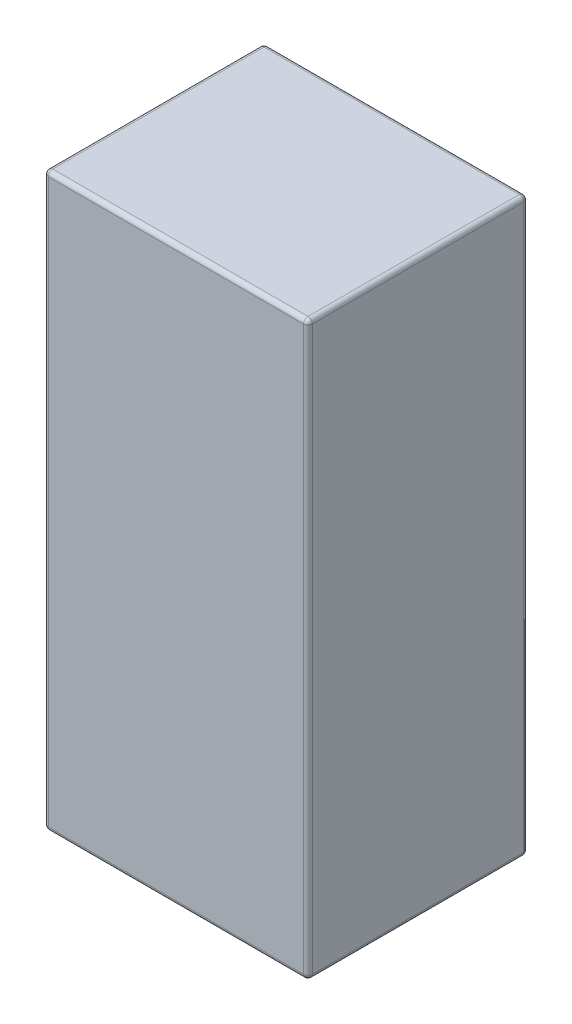
ISO-10303-21;
HEADER;
FILE_DESCRIPTION(('STEP AP214'),'2;1');
FILE_NAME('part.step','',(''),(''),'','','');
FILE_SCHEMA(('AUTOMOTIVE_DESIGN { 1 0 10303 214 1 1 1 1 }'));
ENDSEC;
DATA;
#1=APPLICATION_CONTEXT('core data for automotive mechanical design processes');
#2=APPLICATION_PROTOCOL_DEFINITION('international standard','automotive_design',2000,#1);
#3=PRODUCT_CONTEXT('',#1,'mechanical');
#4=PRODUCT('Part','Part','',(#3));
#5=PRODUCT_RELATED_PRODUCT_CATEGORY('part','',(#4));
#6=PRODUCT_DEFINITION_FORMATION('','',#4);
#7=PRODUCT_DEFINITION_CONTEXT('part definition',#1,'design');
#8=PRODUCT_DEFINITION('design','',#6,#7);
#9=PRODUCT_DEFINITION_SHAPE('','',#8);
#10=(LENGTH_UNIT() NAMED_UNIT(*) SI_UNIT(.MILLI.,.METRE.));
#11=(NAMED_UNIT(*) PLANE_ANGLE_UNIT() SI_UNIT($,.RADIAN.));
#12=(NAMED_UNIT(*) SI_UNIT($,.STERADIAN.) SOLID_ANGLE_UNIT());
#13=UNCERTAINTY_MEASURE_WITH_UNIT(LENGTH_MEASURE(1.E-05),#10,'distance_accuracy_value','');
#14=(GEOMETRIC_REPRESENTATION_CONTEXT(3) GLOBAL_UNCERTAINTY_ASSIGNED_CONTEXT((#13)) GLOBAL_UNIT_ASSIGNED_CONTEXT((#10,
#11,#12)) REPRESENTATION_CONTEXT('',''));
#15=CARTESIAN_POINT('',(0.,0.,0.));
#16=DIRECTION('',(0.,0.,1.));
#17=DIRECTION('',(1.,0.,0.));
#18=AXIS2_PLACEMENT_3D('',#15,#16,#17);
#19=CARTESIAN_POINT('',(3.,6.5,5.));
#20=DIRECTION('',(0.,-1.,0.));
#21=DIRECTION('',(0.,0.,-1.));
#22=AXIS2_PLACEMENT_3D('',#19,#20,#21);
#23=PLANE('',#22);
#24=DIRECTION('',(0.,0.,-1.));
#25=VECTOR('',#24,1.);
#26=CARTESIAN_POINT('',(-2.9,6.5,5.));
#27=LINE('',#26,#25);
#28=CARTESIAN_POINT('',(-2.9,6.5,0.1));
#29=VERTEX_POINT('',#28);
#30=CARTESIAN_POINT('',(-2.9,6.5,4.9));
#31=VERTEX_POINT('',#30);
#32=EDGE_CURVE('E138',#29,#31,#27,.F.);
#33=ORIENTED_EDGE('',*,*,#32,.T.);
#34=DIRECTION('',(-1.,0.,0.));
#35=VECTOR('',#34,1.);
#36=CARTESIAN_POINT('',(3.,6.5,4.9));
#37=LINE('',#36,#35);
#38=CARTESIAN_POINT('',(2.9,6.5,4.9));
#39=VERTEX_POINT('',#38);
#40=EDGE_CURVE('E175',#31,#39,#37,.F.);
#41=ORIENTED_EDGE('',*,*,#40,.T.);
#42=DIRECTION('',(0.,0.,-1.));
#43=VECTOR('',#42,1.);
#44=CARTESIAN_POINT('',(2.9,6.5,5.));
#45=LINE('',#44,#43);
#46=CARTESIAN_POINT('',(2.9,6.5,0.1));
#47=VERTEX_POINT('',#46);
#48=EDGE_CURVE('E172',#39,#47,#45,.T.);
#49=ORIENTED_EDGE('',*,*,#48,.T.);
#50=DIRECTION('',(-1.,0.,0.));
#51=VECTOR('',#50,1.);
#52=CARTESIAN_POINT('',(-3.,6.5,0.1));
#53=LINE('',#52,#51);
#54=EDGE_CURVE('E167',#47,#29,#53,.T.);
#55=ORIENTED_EDGE('',*,*,#54,.T.);
#56=EDGE_LOOP('',(#33,#41,#49,#55));
#57=FACE_BOUND('',#56,.T.);
#58=ADVANCED_FACE('F43',(#57),#23,.F.);
#59=CARTESIAN_POINT('',(-3.,-6.5,5.));
#60=DIRECTION('',(1.,0.,0.));
#61=DIRECTION('',(0.,0.,-1.));
#62=AXIS2_PLACEMENT_3D('',#59,#60,#61);
#63=PLANE('',#62);
#64=DIRECTION('',(0.,0.,-1.));
#65=VECTOR('',#64,1.);
#66=CARTESIAN_POINT('',(-3.,-6.4,5.));
#67=LINE('',#66,#65);
#68=CARTESIAN_POINT('',(-3.,-6.4,0.1));
#69=VERTEX_POINT('',#68);
#70=CARTESIAN_POINT('',(-3.,-6.4,4.9));
#71=VERTEX_POINT('',#70);
#72=EDGE_CURVE('E160',#69,#71,#67,.F.);
#73=ORIENTED_EDGE('',*,*,#72,.T.);
#74=DIRECTION('',(0.,-1.,0.));
#75=VECTOR('',#74,1.);
#76=CARTESIAN_POINT('',(-3.,-6.5,4.9));
#77=LINE('',#76,#75);
#78=CARTESIAN_POINT('',(-3.,6.4,4.9));
#79=VERTEX_POINT('',#78);
#80=EDGE_CURVE('E164',#71,#79,#77,.F.);
#81=ORIENTED_EDGE('',*,*,#80,.T.);
#82=DIRECTION('',(0.,0.,-1.));
#83=VECTOR('',#82,1.);
#84=CARTESIAN_POINT('',(-3.,6.4,5.));
#85=LINE('',#84,#83);
#86=CARTESIAN_POINT('',(-3.,6.4,0.1));
#87=VERTEX_POINT('',#86);
#88=EDGE_CURVE('E136',#79,#87,#85,.T.);
#89=ORIENTED_EDGE('',*,*,#88,.T.);
#90=DIRECTION('',(0.,-1.,0.));
#91=VECTOR('',#90,1.);
#92=CARTESIAN_POINT('',(-3.,-6.5,0.1));
#93=LINE('',#92,#91);
#94=EDGE_CURVE('E154',#87,#69,#93,.T.);
#95=ORIENTED_EDGE('',*,*,#94,.T.);
#96=EDGE_LOOP('',(#73,#81,#89,#95));
#97=FACE_BOUND('',#96,.T.);
#98=ADVANCED_FACE('F162',(#97),#63,.F.);
#99=CARTESIAN_POINT('',(3.,-6.5,5.));
#100=DIRECTION('',(0.,1.,0.));
#101=DIRECTION('',(0.,0.,1.));
#102=AXIS2_PLACEMENT_3D('',#99,#100,#101);
#103=PLANE('',#102);
#104=DIRECTION('',(0.,0.,-1.));
#105=VECTOR('',#104,1.);
#106=CARTESIAN_POINT('',(2.9,-6.5,5.));
#107=LINE('',#106,#105);
#108=CARTESIAN_POINT('',(2.9,-6.5,0.1));
#109=VERTEX_POINT('',#108);
#110=CARTESIAN_POINT('',(2.9,-6.5,4.9));
#111=VERTEX_POINT('',#110);
#112=EDGE_CURVE('E179',#109,#111,#107,.F.);
#113=ORIENTED_EDGE('',*,*,#112,.T.);
#114=DIRECTION('',(1.,0.,0.));
#115=VECTOR('',#114,1.);
#116=CARTESIAN_POINT('',(3.,-6.5,4.9));
#117=LINE('',#116,#115);
#118=CARTESIAN_POINT('',(-2.9,-6.5,4.9));
#119=VERTEX_POINT('',#118);
#120=EDGE_CURVE('E184',#111,#119,#117,.F.);
#121=ORIENTED_EDGE('',*,*,#120,.T.);
#122=DIRECTION('',(0.,0.,-1.));
#123=VECTOR('',#122,1.);
#124=CARTESIAN_POINT('',(-2.9,-6.5,5.));
#125=LINE('',#124,#123);
#126=CARTESIAN_POINT('',(-2.9,-6.5,0.1));
#127=VERTEX_POINT('',#126);
#128=EDGE_CURVE('E181',#119,#127,#125,.T.);
#129=ORIENTED_EDGE('',*,*,#128,.T.);
#130=DIRECTION('',(1.,0.,0.));
#131=VECTOR('',#130,1.);
#132=CARTESIAN_POINT('',(3.,-6.5,0.1));
#133=LINE('',#132,#131);
#134=EDGE_CURVE('E177',#127,#109,#133,.T.);
#135=ORIENTED_EDGE('',*,*,#134,.T.);
#136=EDGE_LOOP('',(#113,#121,#129,#135));
#137=FACE_BOUND('',#136,.T.);
#138=ADVANCED_FACE('F289',(#137),#103,.F.);
#139=CARTESIAN_POINT('',(3.,-6.5,5.));
#140=DIRECTION('',(-1.,0.,0.));
#141=DIRECTION('',(0.,0.,1.));
#142=AXIS2_PLACEMENT_3D('',#139,#140,#141);
#143=PLANE('',#142);
#144=DIRECTION('',(0.,0.,-1.));
#145=VECTOR('',#144,1.);
#146=CARTESIAN_POINT('',(3.,6.4,5.));
#147=LINE('',#146,#145);
#148=CARTESIAN_POINT('',(3.,6.4,0.1));
#149=VERTEX_POINT('',#148);
#150=CARTESIAN_POINT('',(3.,6.4,4.9));
#151=VERTEX_POINT('',#150);
#152=EDGE_CURVE('E188',#149,#151,#147,.F.);
#153=ORIENTED_EDGE('',*,*,#152,.T.);
#154=DIRECTION('',(0.,1.,0.));
#155=VECTOR('',#154,1.);
#156=CARTESIAN_POINT('',(3.,-6.5,4.9));
#157=LINE('',#156,#155);
#158=CARTESIAN_POINT('',(3.,-6.4,4.9));
#159=VERTEX_POINT('',#158);
#160=EDGE_CURVE('E193',#151,#159,#157,.F.);
#161=ORIENTED_EDGE('',*,*,#160,.T.);
#162=DIRECTION('',(0.,0.,-1.));
#163=VECTOR('',#162,1.);
#164=CARTESIAN_POINT('',(3.,-6.4,5.));
#165=LINE('',#164,#163);
#166=CARTESIAN_POINT('',(3.,-6.4,0.1));
#167=VERTEX_POINT('',#166);
#168=EDGE_CURVE('E190',#159,#167,#165,.T.);
#169=ORIENTED_EDGE('',*,*,#168,.T.);
#170=DIRECTION('',(0.,1.,0.));
#171=VECTOR('',#170,1.);
#172=CARTESIAN_POINT('',(3.,6.5,0.1));
#173=LINE('',#172,#171);
#174=EDGE_CURVE('E186',#167,#149,#173,.T.);
#175=ORIENTED_EDGE('',*,*,#174,.T.);
#176=EDGE_LOOP('',(#153,#161,#169,#175));
#177=FACE_BOUND('',#176,.T.);
#178=ADVANCED_FACE('F299',(#177),#143,.F.);
#179=CARTESIAN_POINT('',(0.,0.,5.));
#180=DIRECTION('',(0.,0.,-1.));
#181=DIRECTION('',(-1.,0.,0.));
#182=AXIS2_PLACEMENT_3D('',#179,#180,#181);
#183=PLANE('',#182);
#184=DIRECTION('',(1.,0.,0.));
#185=VECTOR('',#184,1.);
#186=CARTESIAN_POINT('',(0.,-6.4,5.));
#187=LINE('',#186,#185);
#188=CARTESIAN_POINT('',(-2.9,-6.4,5.));
#189=VERTEX_POINT('',#188);
#190=CARTESIAN_POINT('',(2.9,-6.4,5.));
#191=VERTEX_POINT('',#190);
#192=EDGE_CURVE('E199',#189,#191,#187,.T.);
#193=ORIENTED_EDGE('',*,*,#192,.T.);
#194=DIRECTION('',(0.,1.,0.));
#195=VECTOR('',#194,1.);
#196=CARTESIAN_POINT('',(2.9,0.,5.));
#197=LINE('',#196,#195);
#198=CARTESIAN_POINT('',(2.9,6.4,5.));
#199=VERTEX_POINT('',#198);
#200=EDGE_CURVE('E201',#191,#199,#197,.T.);
#201=ORIENTED_EDGE('',*,*,#200,.T.);
#202=DIRECTION('',(-1.,0.,0.));
#203=VECTOR('',#202,1.);
#204=CARTESIAN_POINT('',(0.,6.4,5.));
#205=LINE('',#204,#203);
#206=CARTESIAN_POINT('',(-2.9,6.4,5.));
#207=VERTEX_POINT('',#206);
#208=EDGE_CURVE('E195',#199,#207,#205,.T.);
#209=ORIENTED_EDGE('',*,*,#208,.T.);
#210=DIRECTION('',(0.,-1.,0.));
#211=VECTOR('',#210,1.);
#212=CARTESIAN_POINT('',(-2.9,0.,5.));
#213=LINE('',#212,#211);
#214=EDGE_CURVE('E197',#207,#189,#213,.T.);
#215=ORIENTED_EDGE('',*,*,#214,.T.);
#216=EDGE_LOOP('',(#193,#201,#209,#215));
#217=FACE_BOUND('',#216,.T.);
#218=ADVANCED_FACE('F281',(#217),#183,.F.);
#219=CARTESIAN_POINT('',(0.,0.,0.));
#220=DIRECTION('',(0.,0.,-1.));
#221=DIRECTION('',(-1.,0.,0.));
#222=AXIS2_PLACEMENT_3D('',#219,#220,#221);
#223=PLANE('',#222);
#224=DIRECTION('',(-1.,0.,0.));
#225=VECTOR('',#224,1.);
#226=CARTESIAN_POINT('',(3.,6.4,0.));
#227=LINE('',#226,#225);
#228=CARTESIAN_POINT('',(-2.9,6.4,0.));
#229=VERTEX_POINT('',#228);
#230=CARTESIAN_POINT('',(2.9,6.4,0.));
#231=VERTEX_POINT('',#230);
#232=EDGE_CURVE('E204',#229,#231,#227,.F.);
#233=ORIENTED_EDGE('',*,*,#232,.T.);
#234=DIRECTION('',(0.,1.,0.));
#235=VECTOR('',#234,1.);
#236=CARTESIAN_POINT('',(2.9,-6.5,0.));
#237=LINE('',#236,#235);
#238=CARTESIAN_POINT('',(2.9,-6.4,0.));
#239=VERTEX_POINT('',#238);
#240=EDGE_CURVE('E11',#231,#239,#237,.F.);
#241=ORIENTED_EDGE('',*,*,#240,.T.);
#242=DIRECTION('',(1.,0.,0.));
#243=VECTOR('',#242,1.);
#244=CARTESIAN_POINT('',(-3.,-6.4,0.));
#245=LINE('',#244,#243);
#246=CARTESIAN_POINT('',(-2.9,-6.4,0.));
#247=VERTEX_POINT('',#246);
#248=EDGE_CURVE('E52',#239,#247,#245,.F.);
#249=ORIENTED_EDGE('',*,*,#248,.T.);
#250=DIRECTION('',(0.,-1.,0.));
#251=VECTOR('',#250,1.);
#252=CARTESIAN_POINT('',(-2.9,6.5,0.));
#253=LINE('',#252,#251);
#254=EDGE_CURVE('E206',#247,#229,#253,.F.);
#255=ORIENTED_EDGE('',*,*,#254,.T.);
#256=EDGE_LOOP('',(#233,#241,#249,#255));
#257=FACE_BOUND('',#256,.T.);
#258=ADVANCED_FACE('F487',(#257),#223,.T.);
#259=CARTESIAN_POINT('',(2.9,-6.4,5.));
#260=DIRECTION('',(0.,0.,-1.));
#261=DIRECTION('',(-1.,0.,0.));
#262=AXIS2_PLACEMENT_3D('',#259,#260,#261);
#263=CYLINDRICAL_SURFACE('',#262,0.1);
#264=CARTESIAN_POINT('',(2.9,-6.4,4.9));
#265=DIRECTION('',(0.,0.,1.));
#266=DIRECTION('',(1.,0.,0.));
#267=AXIS2_PLACEMENT_3D('',#264,#265,#266);
#268=CIRCLE('',#267,0.1);
#269=EDGE_CURVE('E47',#111,#159,#268,.T.);
#270=ORIENTED_EDGE('',*,*,#269,.F.);
#271=ORIENTED_EDGE('',*,*,#112,.F.);
#272=CARTESIAN_POINT('',(2.9,-6.4,0.1));
#273=DIRECTION('',(0.,0.,-1.));
#274=DIRECTION('',(-1.,0.,0.));
#275=AXIS2_PLACEMENT_3D('',#272,#273,#274);
#276=CIRCLE('',#275,0.1);
#277=EDGE_CURVE('E259',#167,#109,#276,.T.);
#278=ORIENTED_EDGE('',*,*,#277,.F.);
#279=ORIENTED_EDGE('',*,*,#168,.F.);
#280=EDGE_LOOP('',(#270,#271,#278,#279));
#281=FACE_BOUND('',#280,.T.);
#282=ADVANCED_FACE('F45',(#281),#263,.T.);
#283=CARTESIAN_POINT('',(2.9,-6.4,4.9));
#284=DIRECTION('',(1.,0.,0.));
#285=DIRECTION('',(0.,0.,-1.));
#286=AXIS2_PLACEMENT_3D('',#283,#284,#285);
#287=SPHERICAL_SURFACE('',#286,0.1);
#288=CARTESIAN_POINT('',(2.9,-6.4,4.9));
#289=DIRECTION('',(1.,0.,0.));
#290=DIRECTION('',(0.,0.,-1.));
#291=AXIS2_PLACEMENT_3D('',#288,#289,#290);
#292=CIRCLE('',#291,0.1);
#293=EDGE_CURVE('E254',#111,#191,#292,.F.);
#294=ORIENTED_EDGE('',*,*,#293,.F.);
#295=ORIENTED_EDGE('',*,*,#269,.T.);
#296=CARTESIAN_POINT('',(2.9,-6.4,4.9));
#297=DIRECTION('',(0.,-1.,0.));
#298=DIRECTION('',(0.,0.,-1.));
#299=AXIS2_PLACEMENT_3D('',#296,#297,#298);
#300=CIRCLE('',#299,0.1);
#301=EDGE_CURVE('E257',#191,#159,#300,.F.);
#302=ORIENTED_EDGE('',*,*,#301,.F.);
#303=EDGE_LOOP('',(#294,#295,#302));
#304=FACE_BOUND('',#303,.T.);
#305=ADVANCED_FACE('F269',(#304),#287,.T.);
#306=CARTESIAN_POINT('',(2.9,-6.4,0.1));
#307=DIRECTION('',(0.,-1.,0.));
#308=DIRECTION('',(0.,0.,-1.));
#309=AXIS2_PLACEMENT_3D('',#306,#307,#308);
#310=SPHERICAL_SURFACE('',#309,0.1);
#311=CARTESIAN_POINT('',(2.9,-6.4,0.1));
#312=DIRECTION('',(0.,-1.,0.));
#313=DIRECTION('',(0.,0.,-1.));
#314=AXIS2_PLACEMENT_3D('',#311,#312,#313);
#315=CIRCLE('',#314,0.1);
#316=EDGE_CURVE('E249',#167,#239,#315,.F.);
#317=ORIENTED_EDGE('',*,*,#316,.F.);
#318=ORIENTED_EDGE('',*,*,#277,.T.);
#319=CARTESIAN_POINT('',(2.9,-6.4,0.1));
#320=DIRECTION('',(1.,0.,0.));
#321=DIRECTION('',(0.,0.,-1.));
#322=AXIS2_PLACEMENT_3D('',#319,#320,#321);
#323=CIRCLE('',#322,0.1);
#324=EDGE_CURVE('E252',#239,#109,#323,.F.);
#325=ORIENTED_EDGE('',*,*,#324,.F.);
#326=EDGE_LOOP('',(#317,#318,#325));
#327=FACE_BOUND('',#326,.T.);
#328=ADVANCED_FACE('F466',(#327),#310,.T.);
#329=CARTESIAN_POINT('',(2.9,0.,4.9));
#330=DIRECTION('',(0.,1.,0.));
#331=DIRECTION('',(0.,0.,1.));
#332=AXIS2_PLACEMENT_3D('',#329,#330,#331);
#333=CYLINDRICAL_SURFACE('',#332,0.1);
#334=ORIENTED_EDGE('',*,*,#301,.T.);
#335=ORIENTED_EDGE('',*,*,#160,.F.);
#336=CARTESIAN_POINT('',(2.9,6.4,4.9));
#337=DIRECTION('',(0.,1.,0.));
#338=DIRECTION('',(0.,0.,1.));
#339=AXIS2_PLACEMENT_3D('',#336,#337,#338);
#340=CIRCLE('',#339,0.1);
#341=EDGE_CURVE('E243',#199,#151,#340,.T.);
#342=ORIENTED_EDGE('',*,*,#341,.F.);
#343=ORIENTED_EDGE('',*,*,#200,.F.);
#344=EDGE_LOOP('',(#334,#335,#342,#343));
#345=FACE_BOUND('',#344,.T.);
#346=ADVANCED_FACE('F277',(#345),#333,.T.);
#347=CARTESIAN_POINT('',(0.,-6.4,4.9));
#348=DIRECTION('',(1.,0.,0.));
#349=DIRECTION('',(0.,0.,-1.));
#350=AXIS2_PLACEMENT_3D('',#347,#348,#349);
#351=CYLINDRICAL_SURFACE('',#350,0.1);
#352=ORIENTED_EDGE('',*,*,#293,.T.);
#353=ORIENTED_EDGE('',*,*,#192,.F.);
#354=CARTESIAN_POINT('',(-2.9,-6.4,4.9));
#355=DIRECTION('',(-1.,0.,0.));
#356=DIRECTION('',(0.,0.,1.));
#357=AXIS2_PLACEMENT_3D('',#354,#355,#356);
#358=CIRCLE('',#357,0.1);
#359=EDGE_CURVE('E240',#119,#189,#358,.T.);
#360=ORIENTED_EDGE('',*,*,#359,.F.);
#361=ORIENTED_EDGE('',*,*,#120,.F.);
#362=EDGE_LOOP('',(#352,#353,#360,#361));
#363=FACE_BOUND('',#362,.T.);
#364=ADVANCED_FACE('F286',(#363),#351,.T.);
#365=CARTESIAN_POINT('',(-2.9,-6.4,5.));
#366=DIRECTION('',(0.,0.,-1.));
#367=DIRECTION('',(-1.,0.,0.));
#368=AXIS2_PLACEMENT_3D('',#365,#366,#367);
#369=CYLINDRICAL_SURFACE('',#368,0.1);
#370=CARTESIAN_POINT('',(-2.9,-6.4,0.1));
#371=DIRECTION('',(0.,0.,-1.));
#372=DIRECTION('',(-1.,0.,0.));
#373=AXIS2_PLACEMENT_3D('',#370,#371,#372);
#374=CIRCLE('',#373,0.1);
#375=EDGE_CURVE('E234',#127,#69,#374,.T.);
#376=ORIENTED_EDGE('',*,*,#375,.F.);
#377=ORIENTED_EDGE('',*,*,#128,.F.);
#378=CARTESIAN_POINT('',(-2.9,-6.4,4.9));
#379=DIRECTION('',(0.,0.,1.));
#380=DIRECTION('',(1.,0.,0.));
#381=AXIS2_PLACEMENT_3D('',#378,#379,#380);
#382=CIRCLE('',#381,0.1);
#383=EDGE_CURVE('E237',#71,#119,#382,.T.);
#384=ORIENTED_EDGE('',*,*,#383,.F.);
#385=ORIENTED_EDGE('',*,*,#72,.F.);
#386=EDGE_LOOP('',(#376,#377,#384,#385));
#387=FACE_BOUND('',#386,.T.);
#388=ADVANCED_FACE('F293',(#387),#369,.T.);
#389=CARTESIAN_POINT('',(3.,-6.4,0.1));
#390=DIRECTION('',(-1.,0.,0.));
#391=DIRECTION('',(0.,0.,1.));
#392=AXIS2_PLACEMENT_3D('',#389,#390,#391);
#393=CYLINDRICAL_SURFACE('',#392,0.1);
#394=ORIENTED_EDGE('',*,*,#324,.T.);
#395=ORIENTED_EDGE('',*,*,#134,.F.);
#396=CARTESIAN_POINT('',(-2.9,-6.4,0.1));
#397=DIRECTION('',(-1.,0.,0.));
#398=DIRECTION('',(0.,-1.,0.));
#399=AXIS2_PLACEMENT_3D('',#396,#397,#398);
#400=CIRCLE('',#399,0.1);
#401=EDGE_CURVE('E232',#247,#127,#400,.T.);
#402=ORIENTED_EDGE('',*,*,#401,.F.);
#403=ORIENTED_EDGE('',*,*,#248,.F.);
#404=EDGE_LOOP('',(#394,#395,#402,#403));
#405=FACE_BOUND('',#404,.T.);
#406=ADVANCED_FACE('F297',(#405),#393,.T.);
#407=CARTESIAN_POINT('',(2.9,-6.5,0.1));
#408=DIRECTION('',(0.,-1.,0.));
#409=DIRECTION('',(0.,0.,-1.));
#410=AXIS2_PLACEMENT_3D('',#407,#408,#409);
#411=CYLINDRICAL_SURFACE('',#410,0.1);
#412=ORIENTED_EDGE('',*,*,#316,.T.);
#413=ORIENTED_EDGE('',*,*,#240,.F.);
#414=CARTESIAN_POINT('',(2.9,6.4,0.1));
#415=DIRECTION('',(0.,1.,0.));
#416=DIRECTION('',(0.,0.,1.));
#417=AXIS2_PLACEMENT_3D('',#414,#415,#416);
#418=CIRCLE('',#417,0.1);
#419=EDGE_CURVE('E229',#149,#231,#418,.T.);
#420=ORIENTED_EDGE('',*,*,#419,.F.);
#421=ORIENTED_EDGE('',*,*,#174,.F.);
#422=EDGE_LOOP('',(#412,#413,#420,#421));
#423=FACE_BOUND('',#422,.T.);
#424=ADVANCED_FACE('F309',(#423),#411,.T.);
#425=CARTESIAN_POINT('',(2.9,6.4,5.));
#426=DIRECTION('',(0.,0.,-1.));
#427=DIRECTION('',(-1.,0.,0.));
#428=AXIS2_PLACEMENT_3D('',#425,#426,#427);
#429=CYLINDRICAL_SURFACE('',#428,0.1);
#430=CARTESIAN_POINT('',(2.9,6.4,4.9));
#431=DIRECTION('',(0.,0.,1.));
#432=DIRECTION('',(1.,0.,0.));
#433=AXIS2_PLACEMENT_3D('',#430,#431,#432);
#434=CIRCLE('',#433,0.1);
#435=EDGE_CURVE('E246',#151,#39,#434,.T.);
#436=ORIENTED_EDGE('',*,*,#435,.F.);
#437=ORIENTED_EDGE('',*,*,#152,.F.);
#438=CARTESIAN_POINT('',(2.9,6.4,0.1));
#439=DIRECTION('',(0.,0.,-1.));
#440=DIRECTION('',(-1.,0.,0.));
#441=AXIS2_PLACEMENT_3D('',#438,#439,#440);
#442=CIRCLE('',#441,0.1);
#443=EDGE_CURVE('E226',#47,#149,#442,.T.);
#444=ORIENTED_EDGE('',*,*,#443,.F.);
#445=ORIENTED_EDGE('',*,*,#48,.F.);
#446=EDGE_LOOP('',(#436,#437,#444,#445));
#447=FACE_BOUND('',#446,.T.);
#448=ADVANCED_FACE('F304',(#447),#429,.T.);
#449=CARTESIAN_POINT('',(2.9,6.4,4.9));
#450=DIRECTION('',(1.,0.,0.));
#451=DIRECTION('',(0.,0.,-1.));
#452=AXIS2_PLACEMENT_3D('',#449,#450,#451);
#453=SPHERICAL_SURFACE('',#452,0.1);
#454=ORIENTED_EDGE('',*,*,#341,.T.);
#455=ORIENTED_EDGE('',*,*,#435,.T.);
#456=CARTESIAN_POINT('',(2.9,6.4,4.9));
#457=DIRECTION('',(1.,0.,0.));
#458=DIRECTION('',(0.,0.,-1.));
#459=AXIS2_PLACEMENT_3D('',#456,#457,#458);
#460=CIRCLE('',#459,0.1);
#461=EDGE_CURVE('E223',#199,#39,#460,.F.);
#462=ORIENTED_EDGE('',*,*,#461,.F.);
#463=EDGE_LOOP('',(#454,#455,#462));
#464=FACE_BOUND('',#463,.T.);
#465=ADVANCED_FACE('F320',(#464),#453,.T.);
#466=CARTESIAN_POINT('',(-2.9,-6.4,4.9));
#467=DIRECTION('',(0.,-1.,0.));
#468=DIRECTION('',(1.,0.,0.));
#469=AXIS2_PLACEMENT_3D('',#466,#467,#468);
#470=SPHERICAL_SURFACE('',#469,0.1);
#471=ORIENTED_EDGE('',*,*,#383,.T.);
#472=ORIENTED_EDGE('',*,*,#359,.T.);
#473=CARTESIAN_POINT('',(-2.9,-6.4,4.9));
#474=DIRECTION('',(0.,-1.,0.));
#475=DIRECTION('',(0.,0.,-1.));
#476=AXIS2_PLACEMENT_3D('',#473,#474,#475);
#477=CIRCLE('',#476,0.1);
#478=EDGE_CURVE('E220',#71,#189,#477,.F.);
#479=ORIENTED_EDGE('',*,*,#478,.F.);
#480=EDGE_LOOP('',(#471,#472,#479));
#481=FACE_BOUND('',#480,.T.);
#482=ADVANCED_FACE('F330',(#481),#470,.T.);
#483=CARTESIAN_POINT('',(-2.9,-6.4,0.1));
#484=DIRECTION('',(0.,-1.,0.));
#485=DIRECTION('',(1.,0.,0.));
#486=AXIS2_PLACEMENT_3D('',#483,#484,#485);
#487=SPHERICAL_SURFACE('',#486,0.1);
#488=ORIENTED_EDGE('',*,*,#401,.T.);
#489=ORIENTED_EDGE('',*,*,#375,.T.);
#490=CARTESIAN_POINT('',(-2.9,-6.4,0.1));
#491=DIRECTION('',(0.,-1.,0.));
#492=DIRECTION('',(0.,0.,-1.));
#493=AXIS2_PLACEMENT_3D('',#490,#491,#492);
#494=CIRCLE('',#493,0.1);
#495=EDGE_CURVE('E157',#247,#69,#494,.F.);
#496=ORIENTED_EDGE('',*,*,#495,.F.);
#497=EDGE_LOOP('',(#488,#489,#496));
#498=FACE_BOUND('',#497,.T.);
#499=ADVANCED_FACE('F332',(#498),#487,.T.);
#500=CARTESIAN_POINT('',(2.9,6.4,0.1));
#501=DIRECTION('',(1.,0.,0.));
#502=DIRECTION('',(0.,0.,-1.));
#503=AXIS2_PLACEMENT_3D('',#500,#501,#502);
#504=SPHERICAL_SURFACE('',#503,0.1);
#505=ORIENTED_EDGE('',*,*,#443,.T.);
#506=ORIENTED_EDGE('',*,*,#419,.T.);
#507=CARTESIAN_POINT('',(2.9,6.4,0.1));
#508=DIRECTION('',(1.,0.,0.));
#509=DIRECTION('',(0.,0.,-1.));
#510=AXIS2_PLACEMENT_3D('',#507,#508,#509);
#511=CIRCLE('',#510,0.1);
#512=EDGE_CURVE('E216',#47,#231,#511,.F.);
#513=ORIENTED_EDGE('',*,*,#512,.F.);
#514=EDGE_LOOP('',(#505,#506,#513));
#515=FACE_BOUND('',#514,.T.);
#516=ADVANCED_FACE('F311',(#515),#504,.T.);
#517=CARTESIAN_POINT('',(0.,6.4,4.9));
#518=DIRECTION('',(-1.,0.,0.));
#519=DIRECTION('',(0.,0.,1.));
#520=AXIS2_PLACEMENT_3D('',#517,#518,#519);
#521=CYLINDRICAL_SURFACE('',#520,0.1);
#522=ORIENTED_EDGE('',*,*,#461,.T.);
#523=ORIENTED_EDGE('',*,*,#40,.F.);
#524=CARTESIAN_POINT('',(-2.9,6.4,4.9));
#525=DIRECTION('',(-1.,0.,0.));
#526=DIRECTION('',(0.,0.,1.));
#527=AXIS2_PLACEMENT_3D('',#524,#525,#526);
#528=CIRCLE('',#527,0.1);
#529=EDGE_CURVE('E213',#207,#31,#528,.T.);
#530=ORIENTED_EDGE('',*,*,#529,.F.);
#531=ORIENTED_EDGE('',*,*,#208,.F.);
#532=EDGE_LOOP('',(#522,#523,#530,#531));
#533=FACE_BOUND('',#532,.T.);
#534=ADVANCED_FACE('F322',(#533),#521,.T.);
#535=CARTESIAN_POINT('',(-2.9,0.,4.9));
#536=DIRECTION('',(0.,-1.,0.));
#537=DIRECTION('',(0.,0.,-1.));
#538=AXIS2_PLACEMENT_3D('',#535,#536,#537);
#539=CYLINDRICAL_SURFACE('',#538,0.1);
#540=ORIENTED_EDGE('',*,*,#478,.T.);
#541=ORIENTED_EDGE('',*,*,#214,.F.);
#542=CARTESIAN_POINT('',(-2.9,6.4,4.9));
#543=DIRECTION('',(0.,1.,0.));
#544=DIRECTION('',(0.,0.,1.));
#545=AXIS2_PLACEMENT_3D('',#542,#543,#544);
#546=CIRCLE('',#545,0.1);
#547=EDGE_CURVE('E151',#79,#207,#546,.T.);
#548=ORIENTED_EDGE('',*,*,#547,.F.);
#549=ORIENTED_EDGE('',*,*,#80,.F.);
#550=EDGE_LOOP('',(#540,#541,#548,#549));
#551=FACE_BOUND('',#550,.T.);
#552=ADVANCED_FACE('F328',(#551),#539,.T.);
#553=CARTESIAN_POINT('',(-2.9,-6.5,0.1));
#554=DIRECTION('',(0.,1.,0.));
#555=DIRECTION('',(0.,0.,1.));
#556=AXIS2_PLACEMENT_3D('',#553,#554,#555);
#557=CYLINDRICAL_SURFACE('',#556,0.1);
#558=ORIENTED_EDGE('',*,*,#495,.T.);
#559=ORIENTED_EDGE('',*,*,#94,.F.);
#560=CARTESIAN_POINT('',(-2.9,6.4,0.1));
#561=DIRECTION('',(0.,1.,0.));
#562=DIRECTION('',(-1.,0.,0.));
#563=AXIS2_PLACEMENT_3D('',#560,#561,#562);
#564=CIRCLE('',#563,0.1);
#565=EDGE_CURVE('E144',#229,#87,#564,.T.);
#566=ORIENTED_EDGE('',*,*,#565,.F.);
#567=ORIENTED_EDGE('',*,*,#254,.F.);
#568=EDGE_LOOP('',(#558,#559,#566,#567));
#569=FACE_BOUND('',#568,.T.);
#570=ADVANCED_FACE('F155',(#569),#557,.T.);
#571=CARTESIAN_POINT('',(3.,6.4,0.1));
#572=DIRECTION('',(1.,0.,0.));
#573=DIRECTION('',(0.,0.,-1.));
#574=AXIS2_PLACEMENT_3D('',#571,#572,#573);
#575=CYLINDRICAL_SURFACE('',#574,0.1);
#576=ORIENTED_EDGE('',*,*,#512,.T.);
#577=ORIENTED_EDGE('',*,*,#232,.F.);
#578=CARTESIAN_POINT('',(-2.9,6.4,0.1));
#579=DIRECTION('',(-1.,0.,0.));
#580=DIRECTION('',(0.,0.,1.));
#581=AXIS2_PLACEMENT_3D('',#578,#579,#580);
#582=CIRCLE('',#581,0.1);
#583=EDGE_CURVE('E148',#29,#229,#582,.T.);
#584=ORIENTED_EDGE('',*,*,#583,.F.);
#585=ORIENTED_EDGE('',*,*,#54,.F.);
#586=EDGE_LOOP('',(#576,#577,#584,#585));
#587=FACE_BOUND('',#586,.T.);
#588=ADVANCED_FACE('F315',(#587),#575,.T.);
#589=CARTESIAN_POINT('',(-2.9,6.4,4.9));
#590=DIRECTION('',(0.,0.,1.));
#591=DIRECTION('',(1.,0.,0.));
#592=AXIS2_PLACEMENT_3D('',#589,#590,#591);
#593=SPHERICAL_SURFACE('',#592,0.1);
#594=ORIENTED_EDGE('',*,*,#547,.T.);
#595=ORIENTED_EDGE('',*,*,#529,.T.);
#596=CARTESIAN_POINT('',(-2.9,6.4,4.9));
#597=DIRECTION('',(0.,0.,1.));
#598=DIRECTION('',(1.,0.,0.));
#599=AXIS2_PLACEMENT_3D('',#596,#597,#598);
#600=CIRCLE('',#599,0.1);
#601=EDGE_CURVE('E141',#79,#31,#600,.F.);
#602=ORIENTED_EDGE('',*,*,#601,.F.);
#603=EDGE_LOOP('',(#594,#595,#602));
#604=FACE_BOUND('',#603,.T.);
#605=ADVANCED_FACE('F326',(#604),#593,.T.);
#606=CARTESIAN_POINT('',(-2.9,6.4,0.1));
#607=DIRECTION('',(0.,0.,-1.));
#608=DIRECTION('',(-1.,0.,0.));
#609=AXIS2_PLACEMENT_3D('',#606,#607,#608);
#610=SPHERICAL_SURFACE('',#609,0.1);
#611=ORIENTED_EDGE('',*,*,#583,.T.);
#612=ORIENTED_EDGE('',*,*,#565,.T.);
#613=CARTESIAN_POINT('',(-2.9,6.4,0.1));
#614=DIRECTION('',(0.,0.,-1.));
#615=DIRECTION('',(-1.,0.,0.));
#616=AXIS2_PLACEMENT_3D('',#613,#614,#615);
#617=CIRCLE('',#616,0.1);
#618=EDGE_CURVE('E132',#29,#87,#617,.F.);
#619=ORIENTED_EDGE('',*,*,#618,.F.);
#620=EDGE_LOOP('',(#611,#612,#619));
#621=FACE_BOUND('',#620,.T.);
#622=ADVANCED_FACE('F146',(#621),#610,.T.);
#623=CARTESIAN_POINT('',(-2.9,6.4,5.));
#624=DIRECTION('',(0.,0.,-1.));
#625=DIRECTION('',(-1.,0.,0.));
#626=AXIS2_PLACEMENT_3D('',#623,#624,#625);
#627=CYLINDRICAL_SURFACE('',#626,0.1);
#628=ORIENTED_EDGE('',*,*,#601,.T.);
#629=ORIENTED_EDGE('',*,*,#32,.F.);
#630=ORIENTED_EDGE('',*,*,#618,.T.);
#631=ORIENTED_EDGE('',*,*,#88,.F.);
#632=EDGE_LOOP('',(#628,#629,#630,#631));
#633=FACE_BOUND('',#632,.T.);
#634=ADVANCED_FACE('F134',(#633),#627,.T.);
#635=CLOSED_SHELL('',(#58,#98,#138,#178,#218,#258,#282,#305,#328,#346,#364,#388,#406,#424,#448,
#465,#482,#499,#516,#534,#552,#570,#588,#605,#622,#634));
#636=MANIFOLD_SOLID_BREP('B2',#635);
#637=ADVANCED_BREP_SHAPE_REPRESENTATION('',(#18,#636),#14);
#638=SHAPE_DEFINITION_REPRESENTATION(#9,#637);
ENDSEC;
END-ISO-10303-21;
